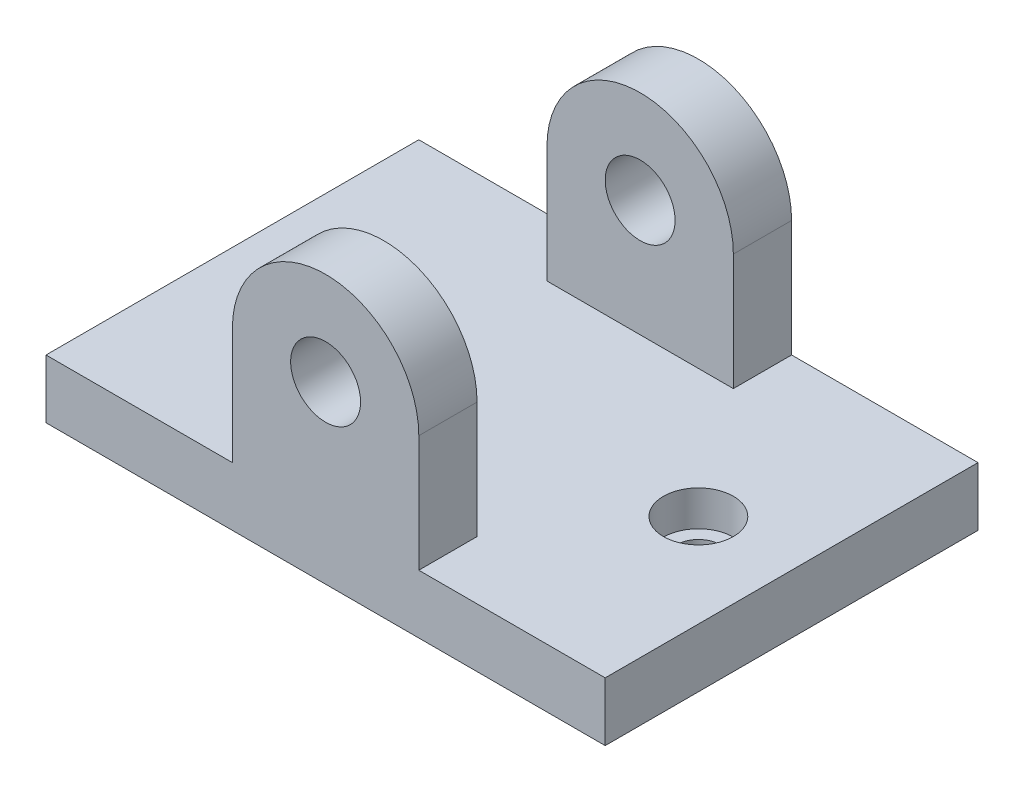
ISO-10303-21;
HEADER;
FILE_DESCRIPTION(('STEP AP214'),'2;1');
FILE_NAME('part.step','',(''),(''),'','','');
FILE_SCHEMA(('AUTOMOTIVE_DESIGN { 1 0 10303 214 1 1 1 1 }'));
ENDSEC;
DATA;
#1=APPLICATION_CONTEXT('core data for automotive mechanical design processes');
#2=APPLICATION_PROTOCOL_DEFINITION('international standard','automotive_design',2000,#1);
#3=PRODUCT_CONTEXT('',#1,'mechanical');
#4=PRODUCT('Part','Part','',(#3));
#5=PRODUCT_RELATED_PRODUCT_CATEGORY('part','',(#4));
#6=PRODUCT_DEFINITION_FORMATION('','',#4);
#7=PRODUCT_DEFINITION_CONTEXT('part definition',#1,'design');
#8=PRODUCT_DEFINITION('design','',#6,#7);
#9=PRODUCT_DEFINITION_SHAPE('','',#8);
#10=(LENGTH_UNIT() NAMED_UNIT(*) SI_UNIT(.MILLI.,.METRE.));
#11=(NAMED_UNIT(*) PLANE_ANGLE_UNIT() SI_UNIT($,.RADIAN.));
#12=(NAMED_UNIT(*) SI_UNIT($,.STERADIAN.) SOLID_ANGLE_UNIT());
#13=UNCERTAINTY_MEASURE_WITH_UNIT(LENGTH_MEASURE(1.E-05),#10,'distance_accuracy_value','');
#14=(GEOMETRIC_REPRESENTATION_CONTEXT(3) GLOBAL_UNCERTAINTY_ASSIGNED_CONTEXT((#13)) GLOBAL_UNIT_ASSIGNED_CONTEXT((#10,
#11,#12)) REPRESENTATION_CONTEXT('',''));
#15=CARTESIAN_POINT('',(0.,0.,0.));
#16=DIRECTION('',(0.,0.,1.));
#17=DIRECTION('',(1.,0.,0.));
#18=AXIS2_PLACEMENT_3D('',#15,#16,#17);
#19=CARTESIAN_POINT('',(0.,16.002,0.));
#20=DIRECTION('',(0.,1.,0.));
#21=DIRECTION('',(0.,0.,1.));
#22=AXIS2_PLACEMENT_3D('',#19,#20,#21);
#23=PLANE('',#22);
#24=CARTESIAN_POINT('',(-50.8,16.002,0.));
#25=DIRECTION('',(0.,1.,0.));
#26=DIRECTION('',(0.,0.,1.));
#27=AXIS2_PLACEMENT_3D('',#24,#25,#26);
#28=CIRCLE('',#27,9.525);
#29=CARTESIAN_POINT('',(-50.8,16.002,9.525));
#30=VERTEX_POINT('',#29);
#31=EDGE_CURVE('E185',#30,#30,#28,.T.);
#32=ORIENTED_EDGE('',*,*,#31,.F.);
#33=EDGE_LOOP('',(#32));
#34=FACE_BOUND('',#33,.T.);
#35=CARTESIAN_POINT('',(50.8,16.002,0.));
#36=DIRECTION('',(0.,1.,0.));
#37=DIRECTION('',(0.,0.,1.));
#38=AXIS2_PLACEMENT_3D('',#35,#36,#37);
#39=CIRCLE('',#38,9.525);
#40=CARTESIAN_POINT('',(50.8,16.002,9.525));
#41=VERTEX_POINT('',#40);
#42=EDGE_CURVE('E203',#41,#41,#39,.T.);
#43=ORIENTED_EDGE('',*,*,#42,.F.);
#44=EDGE_LOOP('',(#43));
#45=FACE_BOUND('',#44,.T.);
#46=DIRECTION('',(-1.,0.,0.));
#47=VECTOR('',#46,1.);
#48=CARTESIAN_POINT('',(-76.2,16.002,-50.8));
#49=LINE('',#48,#47);
#50=CARTESIAN_POINT('',(76.2,16.002,-50.8));
#51=VERTEX_POINT('',#50);
#52=CARTESIAN_POINT('',(25.4,16.002,-50.8));
#53=VERTEX_POINT('',#52);
#54=EDGE_CURVE('E221',#51,#53,#49,.T.);
#55=ORIENTED_EDGE('',*,*,#54,.T.);
#56=DIRECTION('',(0.,0.,-1.));
#57=VECTOR('',#56,1.);
#58=CARTESIAN_POINT('',(25.4,16.002,-34.925));
#59=LINE('',#58,#57);
#60=CARTESIAN_POINT('',(25.4,16.002,-34.925));
#61=VERTEX_POINT('',#60);
#62=EDGE_CURVE('E51',#61,#53,#59,.T.);
#63=ORIENTED_EDGE('',*,*,#62,.F.);
#64=DIRECTION('',(1.,0.,0.));
#65=VECTOR('',#64,1.);
#66=CARTESIAN_POINT('',(25.4,16.002,-34.925));
#67=LINE('',#66,#65);
#68=CARTESIAN_POINT('',(-25.4,16.002,-34.925));
#69=VERTEX_POINT('',#68);
#70=EDGE_CURVE('E56',#69,#61,#67,.T.);
#71=ORIENTED_EDGE('',*,*,#70,.F.);
#72=DIRECTION('',(0.,0.,-1.));
#73=VECTOR('',#72,1.);
#74=CARTESIAN_POINT('',(-25.4,16.002,-34.925));
#75=LINE('',#74,#73);
#76=CARTESIAN_POINT('',(-25.4,16.002,-50.8));
#77=VERTEX_POINT('',#76);
#78=EDGE_CURVE('E144',#69,#77,#75,.T.);
#79=ORIENTED_EDGE('',*,*,#78,.T.);
#80=CARTESIAN_POINT('',(-76.2,16.002,-50.8));
#81=VERTEX_POINT('',#80);
#82=EDGE_CURVE('E219',#77,#81,#49,.T.);
#83=ORIENTED_EDGE('',*,*,#82,.T.);
#84=DIRECTION('',(0.,0.,1.));
#85=VECTOR('',#84,1.);
#86=CARTESIAN_POINT('',(-76.2,16.002,-50.8));
#87=LINE('',#86,#85);
#88=CARTESIAN_POINT('',(-76.2,16.002,50.8));
#89=VERTEX_POINT('',#88);
#90=EDGE_CURVE('E223',#81,#89,#87,.T.);
#91=ORIENTED_EDGE('',*,*,#90,.T.);
#92=DIRECTION('',(1.,0.,0.));
#93=VECTOR('',#92,1.);
#94=CARTESIAN_POINT('',(-76.2,16.002,50.8));
#95=LINE('',#94,#93);
#96=CARTESIAN_POINT('',(-25.4,16.002,50.8));
#97=VERTEX_POINT('',#96);
#98=EDGE_CURVE('E226',#89,#97,#95,.T.);
#99=ORIENTED_EDGE('',*,*,#98,.T.);
#100=DIRECTION('',(0.,0.,1.));
#101=VECTOR('',#100,1.);
#102=CARTESIAN_POINT('',(-25.4,16.002,34.925));
#103=LINE('',#102,#101);
#104=CARTESIAN_POINT('',(-25.4,16.002,34.925));
#105=VERTEX_POINT('',#104);
#106=EDGE_CURVE('E183',#105,#97,#103,.T.);
#107=ORIENTED_EDGE('',*,*,#106,.F.);
#108=DIRECTION('',(1.,0.,0.));
#109=VECTOR('',#108,1.);
#110=CARTESIAN_POINT('',(25.4,16.002,34.925));
#111=LINE('',#110,#109);
#112=CARTESIAN_POINT('',(25.4,16.002,34.925));
#113=VERTEX_POINT('',#112);
#114=EDGE_CURVE('E162',#105,#113,#111,.T.);
#115=ORIENTED_EDGE('',*,*,#114,.T.);
#116=DIRECTION('',(0.,0.,1.));
#117=VECTOR('',#116,1.);
#118=CARTESIAN_POINT('',(25.4,16.002,34.925));
#119=LINE('',#118,#117);
#120=CARTESIAN_POINT('',(25.4,16.002,50.8));
#121=VERTEX_POINT('',#120);
#122=EDGE_CURVE('E175',#113,#121,#119,.T.);
#123=ORIENTED_EDGE('',*,*,#122,.T.);
#124=CARTESIAN_POINT('',(76.2,16.002,50.8));
#125=VERTEX_POINT('',#124);
#126=EDGE_CURVE('E225',#121,#125,#95,.T.);
#127=ORIENTED_EDGE('',*,*,#126,.T.);
#128=DIRECTION('',(0.,0.,-1.));
#129=VECTOR('',#128,1.);
#130=CARTESIAN_POINT('',(76.2,16.002,-50.8));
#131=LINE('',#130,#129);
#132=EDGE_CURVE('E216',#125,#51,#131,.T.);
#133=ORIENTED_EDGE('',*,*,#132,.T.);
#134=EDGE_LOOP('',(#55,#63,#71,#79,#83,#91,#99,#107,#115,#123,#127,#133));
#135=FACE_BOUND('',#134,.T.);
#136=ADVANCED_FACE('F35',(#34,#45,#135),#23,.T.);
#137=CARTESIAN_POINT('',(76.2,16.002,-50.8));
#138=DIRECTION('',(-1.,0.,0.));
#139=DIRECTION('',(0.,0.,1.));
#140=AXIS2_PLACEMENT_3D('',#137,#138,#139);
#141=PLANE('',#140);
#142=DIRECTION('',(0.,0.,-1.));
#143=VECTOR('',#142,1.);
#144=CARTESIAN_POINT('',(76.2,0.,-50.8));
#145=LINE('',#144,#143);
#146=CARTESIAN_POINT('',(76.2,0.,50.8));
#147=VERTEX_POINT('',#146);
#148=CARTESIAN_POINT('',(76.2,0.,-50.8));
#149=VERTEX_POINT('',#148);
#150=EDGE_CURVE('E215',#147,#149,#145,.T.);
#151=ORIENTED_EDGE('',*,*,#150,.T.);
#152=DIRECTION('',(0.,-1.,0.));
#153=VECTOR('',#152,1.);
#154=CARTESIAN_POINT('',(76.2,16.002,-50.8));
#155=LINE('',#154,#153);
#156=EDGE_CURVE('E11',#51,#149,#155,.T.);
#157=ORIENTED_EDGE('',*,*,#156,.F.);
#158=ORIENTED_EDGE('',*,*,#132,.F.);
#159=DIRECTION('',(0.,-1.,0.));
#160=VECTOR('',#159,1.);
#161=CARTESIAN_POINT('',(76.2,16.002,50.8));
#162=LINE('',#161,#160);
#163=EDGE_CURVE('E229',#125,#147,#162,.T.);
#164=ORIENTED_EDGE('',*,*,#163,.T.);
#165=EDGE_LOOP('',(#151,#157,#158,#164));
#166=FACE_BOUND('',#165,.T.);
#167=ADVANCED_FACE('F37',(#166),#141,.F.);
#168=CARTESIAN_POINT('',(-76.2,16.002,-50.8));
#169=DIRECTION('',(0.,0.,1.));
#170=DIRECTION('',(1.,0.,0.));
#171=AXIS2_PLACEMENT_3D('',#168,#169,#170);
#172=PLANE('',#171);
#173=CARTESIAN_POINT('',(0.,47.752,-50.8));
#174=DIRECTION('',(0.,0.,1.));
#175=DIRECTION('',(1.,0.,0.));
#176=AXIS2_PLACEMENT_3D('',#173,#174,#175);
#177=CIRCLE('',#176,9.525);
#178=CARTESIAN_POINT('',(9.52500000000001,47.752,-50.8));
#179=VERTEX_POINT('',#178);
#180=EDGE_CURVE('E314',#179,#179,#177,.T.);
#181=ORIENTED_EDGE('',*,*,#180,.T.);
#182=EDGE_LOOP('',(#181));
#183=FACE_BOUND('',#182,.T.);
#184=DIRECTION('',(-1.,0.,0.));
#185=VECTOR('',#184,1.);
#186=CARTESIAN_POINT('',(-76.2,0.,-50.8));
#187=LINE('',#186,#185);
#188=CARTESIAN_POINT('',(-76.2,0.,-50.8));
#189=VERTEX_POINT('',#188);
#190=EDGE_CURVE('E232',#149,#189,#187,.T.);
#191=ORIENTED_EDGE('',*,*,#190,.T.);
#192=DIRECTION('',(0.,-1.,0.));
#193=VECTOR('',#192,1.);
#194=CARTESIAN_POINT('',(-76.2,16.002,-50.8));
#195=LINE('',#194,#193);
#196=EDGE_CURVE('E44',#81,#189,#195,.T.);
#197=ORIENTED_EDGE('',*,*,#196,.F.);
#198=ORIENTED_EDGE('',*,*,#82,.F.);
#199=DIRECTION('',(0.,-1.,0.));
#200=VECTOR('',#199,1.);
#201=CARTESIAN_POINT('',(-25.4,16.002,-50.8));
#202=LINE('',#201,#200);
#203=CARTESIAN_POINT('',(-25.4,47.752,-50.8));
#204=VERTEX_POINT('',#203);
#205=EDGE_CURVE('E153',#204,#77,#202,.T.);
#206=ORIENTED_EDGE('',*,*,#205,.F.);
#207=CARTESIAN_POINT('',(0.,47.752,-50.8));
#208=DIRECTION('',(0.,0.,1.));
#209=DIRECTION('',(-1.,0.,0.));
#210=AXIS2_PLACEMENT_3D('',#207,#208,#209);
#211=CIRCLE('',#210,25.4);
#212=CARTESIAN_POINT('',(25.4,47.752,-50.8));
#213=VERTEX_POINT('',#212);
#214=EDGE_CURVE('E139',#213,#204,#211,.T.);
#215=ORIENTED_EDGE('',*,*,#214,.F.);
#216=DIRECTION('',(0.,1.,0.));
#217=VECTOR('',#216,1.);
#218=CARTESIAN_POINT('',(25.4,47.752,-50.8));
#219=LINE('',#218,#217);
#220=EDGE_CURVE('E148',#53,#213,#219,.T.);
#221=ORIENTED_EDGE('',*,*,#220,.F.);
#222=ORIENTED_EDGE('',*,*,#54,.F.);
#223=ORIENTED_EDGE('',*,*,#156,.T.);
#224=EDGE_LOOP('',(#191,#197,#198,#206,#215,#221,#222,#223));
#225=FACE_BOUND('',#224,.T.);
#226=ADVANCED_FACE('F275',(#183,#225),#172,.F.);
#227=CARTESIAN_POINT('',(-76.2,16.002,-50.8));
#228=DIRECTION('',(1.,0.,0.));
#229=DIRECTION('',(0.,0.,-1.));
#230=AXIS2_PLACEMENT_3D('',#227,#228,#229);
#231=PLANE('',#230);
#232=DIRECTION('',(0.,0.,1.));
#233=VECTOR('',#232,1.);
#234=CARTESIAN_POINT('',(-76.2,0.,-50.8));
#235=LINE('',#234,#233);
#236=CARTESIAN_POINT('',(-76.2,0.,50.8));
#237=VERTEX_POINT('',#236);
#238=EDGE_CURVE('E234',#189,#237,#235,.T.);
#239=ORIENTED_EDGE('',*,*,#238,.T.);
#240=DIRECTION('',(0.,-1.,0.));
#241=VECTOR('',#240,1.);
#242=CARTESIAN_POINT('',(-76.2,16.002,50.8));
#243=LINE('',#242,#241);
#244=EDGE_CURVE('E239',#89,#237,#243,.T.);
#245=ORIENTED_EDGE('',*,*,#244,.F.);
#246=ORIENTED_EDGE('',*,*,#90,.F.);
#247=ORIENTED_EDGE('',*,*,#196,.T.);
#248=EDGE_LOOP('',(#239,#245,#246,#247));
#249=FACE_BOUND('',#248,.T.);
#250=ADVANCED_FACE('F247',(#249),#231,.F.);
#251=CARTESIAN_POINT('',(-76.2,16.002,50.8));
#252=DIRECTION('',(0.,0.,-1.));
#253=DIRECTION('',(-1.,0.,0.));
#254=AXIS2_PLACEMENT_3D('',#251,#252,#253);
#255=PLANE('',#254);
#256=CARTESIAN_POINT('',(0.,47.752,50.8));
#257=DIRECTION('',(0.,0.,1.));
#258=DIRECTION('',(1.,0.,0.));
#259=AXIS2_PLACEMENT_3D('',#256,#257,#258);
#260=CIRCLE('',#259,9.525);
#261=CARTESIAN_POINT('',(9.52500000000001,47.752,50.8));
#262=VERTEX_POINT('',#261);
#263=EDGE_CURVE('E316',#262,#262,#260,.T.);
#264=ORIENTED_EDGE('',*,*,#263,.F.);
#265=EDGE_LOOP('',(#264));
#266=FACE_BOUND('',#265,.T.);
#267=DIRECTION('',(1.,0.,0.));
#268=VECTOR('',#267,1.);
#269=CARTESIAN_POINT('',(-76.2,0.,50.8));
#270=LINE('',#269,#268);
#271=EDGE_CURVE('E220',#237,#147,#270,.T.);
#272=ORIENTED_EDGE('',*,*,#271,.T.);
#273=ORIENTED_EDGE('',*,*,#163,.F.);
#274=ORIENTED_EDGE('',*,*,#126,.F.);
#275=DIRECTION('',(0.,1.,0.));
#276=VECTOR('',#275,1.);
#277=CARTESIAN_POINT('',(25.4,47.752,50.8));
#278=LINE('',#277,#276);
#279=CARTESIAN_POINT('',(25.4,47.752,50.8));
#280=VERTEX_POINT('',#279);
#281=EDGE_CURVE('E159',#121,#280,#278,.T.);
#282=ORIENTED_EDGE('',*,*,#281,.T.);
#283=CARTESIAN_POINT('',(0.,47.752,50.8));
#284=DIRECTION('',(0.,0.,1.));
#285=DIRECTION('',(-1.,0.,0.));
#286=AXIS2_PLACEMENT_3D('',#283,#284,#285);
#287=CIRCLE('',#286,25.4);
#288=CARTESIAN_POINT('',(-25.4,47.752,50.8));
#289=VERTEX_POINT('',#288);
#290=EDGE_CURVE('E178',#280,#289,#287,.T.);
#291=ORIENTED_EDGE('',*,*,#290,.T.);
#292=DIRECTION('',(0.,-1.,0.));
#293=VECTOR('',#292,1.);
#294=CARTESIAN_POINT('',(-25.4,16.002,50.8));
#295=LINE('',#294,#293);
#296=EDGE_CURVE('E166',#289,#97,#295,.T.);
#297=ORIENTED_EDGE('',*,*,#296,.T.);
#298=ORIENTED_EDGE('',*,*,#98,.F.);
#299=ORIENTED_EDGE('',*,*,#244,.T.);
#300=EDGE_LOOP('',(#272,#273,#274,#282,#291,#297,#298,#299));
#301=FACE_BOUND('',#300,.T.);
#302=ADVANCED_FACE('F256',(#266,#301),#255,.F.);
#303=CARTESIAN_POINT('',(0.,0.,0.));
#304=DIRECTION('',(0.,1.,0.));
#305=DIRECTION('',(0.,0.,1.));
#306=AXIS2_PLACEMENT_3D('',#303,#304,#305);
#307=PLANE('',#306);
#308=CARTESIAN_POINT('',(-50.8,0.,0.));
#309=DIRECTION('',(0.,1.,0.));
#310=DIRECTION('',(0.,0.,1.));
#311=AXIS2_PLACEMENT_3D('',#308,#309,#310);
#312=CIRCLE('',#311,5.9563);
#313=CARTESIAN_POINT('',(-50.8,0.,5.9563));
#314=VERTEX_POINT('',#313);
#315=EDGE_CURVE('E200',#314,#314,#312,.T.);
#316=ORIENTED_EDGE('',*,*,#315,.T.);
#317=EDGE_LOOP('',(#316));
#318=FACE_BOUND('',#317,.T.);
#319=CARTESIAN_POINT('',(50.8,0.,0.));
#320=DIRECTION('',(0.,1.,0.));
#321=DIRECTION('',(0.,0.,1.));
#322=AXIS2_PLACEMENT_3D('',#319,#320,#321);
#323=CIRCLE('',#322,5.9563);
#324=CARTESIAN_POINT('',(50.8,0.,5.9563));
#325=VERTEX_POINT('',#324);
#326=EDGE_CURVE('E212',#325,#325,#323,.T.);
#327=ORIENTED_EDGE('',*,*,#326,.T.);
#328=EDGE_LOOP('',(#327));
#329=FACE_BOUND('',#328,.T.);
#330=ORIENTED_EDGE('',*,*,#150,.F.);
#331=ORIENTED_EDGE('',*,*,#271,.F.);
#332=ORIENTED_EDGE('',*,*,#238,.F.);
#333=ORIENTED_EDGE('',*,*,#190,.F.);
#334=EDGE_LOOP('',(#330,#331,#332,#333));
#335=FACE_BOUND('',#334,.T.);
#336=ADVANCED_FACE('F253',(#318,#329,#335),#307,.F.);
#337=CARTESIAN_POINT('',(50.8,16.002,0.));
#338=DIRECTION('',(0.,1.,0.));
#339=DIRECTION('',(0.,0.,1.));
#340=AXIS2_PLACEMENT_3D('',#337,#338,#339);
#341=CYLINDRICAL_SURFACE('',#340,5.9563);
#342=ORIENTED_EDGE('',*,*,#326,.F.);
#343=EDGE_LOOP('',(#342));
#344=FACE_BOUND('',#343,.T.);
#345=CARTESIAN_POINT('',(50.8,6.35,0.));
#346=DIRECTION('',(0.,1.,0.));
#347=DIRECTION('',(0.,0.,1.));
#348=AXIS2_PLACEMENT_3D('',#345,#346,#347);
#349=CIRCLE('',#348,5.9563);
#350=CARTESIAN_POINT('',(50.8,6.35,5.9563));
#351=VERTEX_POINT('',#350);
#352=EDGE_CURVE('E209',#351,#351,#349,.T.);
#353=ORIENTED_EDGE('',*,*,#352,.T.);
#354=EDGE_LOOP('',(#353));
#355=FACE_BOUND('',#354,.T.);
#356=ADVANCED_FACE('F299',(#344,#355),#341,.F.);
#357=CARTESIAN_POINT('',(56.7563,6.35,0.));
#358=DIRECTION('',(0.,-1.,0.));
#359=DIRECTION('',(0.,0.,-1.));
#360=AXIS2_PLACEMENT_3D('',#357,#358,#359);
#361=PLANE('',#360);
#362=ORIENTED_EDGE('',*,*,#352,.F.);
#363=EDGE_LOOP('',(#362));
#364=FACE_BOUND('',#363,.T.);
#365=CARTESIAN_POINT('',(50.8,6.35,0.));
#366=DIRECTION('',(0.,1.,0.));
#367=DIRECTION('',(0.,0.,1.));
#368=AXIS2_PLACEMENT_3D('',#365,#366,#367);
#369=CIRCLE('',#368,9.525);
#370=CARTESIAN_POINT('',(50.8,6.35,9.525));
#371=VERTEX_POINT('',#370);
#372=EDGE_CURVE('E206',#371,#371,#369,.T.);
#373=ORIENTED_EDGE('',*,*,#372,.T.);
#374=EDGE_LOOP('',(#373));
#375=FACE_BOUND('',#374,.T.);
#376=ADVANCED_FACE('F365',(#364,#375),#361,.F.);
#377=CARTESIAN_POINT('',(50.8,16.002,0.));
#378=DIRECTION('',(0.,1.,0.));
#379=DIRECTION('',(0.,0.,1.));
#380=AXIS2_PLACEMENT_3D('',#377,#378,#379);
#381=CYLINDRICAL_SURFACE('',#380,9.525);
#382=ORIENTED_EDGE('',*,*,#372,.F.);
#383=EDGE_LOOP('',(#382));
#384=FACE_BOUND('',#383,.T.);
#385=ORIENTED_EDGE('',*,*,#42,.T.);
#386=EDGE_LOOP('',(#385));
#387=FACE_BOUND('',#386,.T.);
#388=ADVANCED_FACE('F362',(#384,#387),#381,.F.);
#389=CARTESIAN_POINT('',(-50.8,16.002,0.));
#390=DIRECTION('',(0.,1.,0.));
#391=DIRECTION('',(0.,0.,1.));
#392=AXIS2_PLACEMENT_3D('',#389,#390,#391);
#393=CYLINDRICAL_SURFACE('',#392,5.9563);
#394=ORIENTED_EDGE('',*,*,#315,.F.);
#395=EDGE_LOOP('',(#394));
#396=FACE_BOUND('',#395,.T.);
#397=CARTESIAN_POINT('',(-50.8,6.35,0.));
#398=DIRECTION('',(0.,1.,0.));
#399=DIRECTION('',(0.,0.,1.));
#400=AXIS2_PLACEMENT_3D('',#397,#398,#399);
#401=CIRCLE('',#400,5.9563);
#402=CARTESIAN_POINT('',(-50.8,6.35,5.9563));
#403=VERTEX_POINT('',#402);
#404=EDGE_CURVE('E197',#403,#403,#401,.T.);
#405=ORIENTED_EDGE('',*,*,#404,.T.);
#406=EDGE_LOOP('',(#405));
#407=FACE_BOUND('',#406,.T.);
#408=ADVANCED_FACE('F358',(#396,#407),#393,.F.);
#409=CARTESIAN_POINT('',(-44.8437,6.35,0.));
#410=DIRECTION('',(0.,-1.,0.));
#411=DIRECTION('',(0.,0.,-1.));
#412=AXIS2_PLACEMENT_3D('',#409,#410,#411);
#413=PLANE('',#412);
#414=ORIENTED_EDGE('',*,*,#404,.F.);
#415=EDGE_LOOP('',(#414));
#416=FACE_BOUND('',#415,.T.);
#417=CARTESIAN_POINT('',(-50.8,6.35,0.));
#418=DIRECTION('',(0.,1.,0.));
#419=DIRECTION('',(0.,0.,1.));
#420=AXIS2_PLACEMENT_3D('',#417,#418,#419);
#421=CIRCLE('',#420,9.525);
#422=CARTESIAN_POINT('',(-50.8,6.35,9.525));
#423=VERTEX_POINT('',#422);
#424=EDGE_CURVE('E194',#423,#423,#421,.T.);
#425=ORIENTED_EDGE('',*,*,#424,.T.);
#426=EDGE_LOOP('',(#425));
#427=FACE_BOUND('',#426,.T.);
#428=ADVANCED_FACE('F354',(#416,#427),#413,.F.);
#429=CARTESIAN_POINT('',(-50.8,16.002,0.));
#430=DIRECTION('',(0.,1.,0.));
#431=DIRECTION('',(0.,0.,1.));
#432=AXIS2_PLACEMENT_3D('',#429,#430,#431);
#433=CYLINDRICAL_SURFACE('',#432,9.525);
#434=ORIENTED_EDGE('',*,*,#424,.F.);
#435=EDGE_LOOP('',(#434));
#436=FACE_BOUND('',#435,.T.);
#437=ORIENTED_EDGE('',*,*,#31,.T.);
#438=EDGE_LOOP('',(#437));
#439=FACE_BOUND('',#438,.T.);
#440=ADVANCED_FACE('F347',(#436,#439),#433,.F.);
#441=CARTESIAN_POINT('',(-25.4,16.002,34.925));
#442=DIRECTION('',(-1.,0.,0.));
#443=DIRECTION('',(0.,0.,1.));
#444=AXIS2_PLACEMENT_3D('',#441,#442,#443);
#445=PLANE('',#444);
#446=ORIENTED_EDGE('',*,*,#296,.F.);
#447=DIRECTION('',(0.,0.,1.));
#448=VECTOR('',#447,1.);
#449=CARTESIAN_POINT('',(-25.4,47.752,34.925));
#450=LINE('',#449,#448);
#451=CARTESIAN_POINT('',(-25.4,47.752,34.925));
#452=VERTEX_POINT('',#451);
#453=EDGE_CURVE('E186',#452,#289,#450,.T.);
#454=ORIENTED_EDGE('',*,*,#453,.F.);
#455=DIRECTION('',(0.,-1.,0.));
#456=VECTOR('',#455,1.);
#457=CARTESIAN_POINT('',(-25.4,16.002,34.925));
#458=LINE('',#457,#456);
#459=EDGE_CURVE('E172',#452,#105,#458,.T.);
#460=ORIENTED_EDGE('',*,*,#459,.T.);
#461=ORIENTED_EDGE('',*,*,#106,.T.);
#462=EDGE_LOOP('',(#446,#454,#460,#461));
#463=FACE_BOUND('',#462,.T.);
#464=ADVANCED_FACE('F273',(#463),#445,.T.);
#465=CARTESIAN_POINT('',(0.,47.752,34.925));
#466=DIRECTION('',(0.,0.,1.));
#467=DIRECTION('',(1.,0.,0.));
#468=AXIS2_PLACEMENT_3D('',#465,#466,#467);
#469=CYLINDRICAL_SURFACE('',#468,25.4);
#470=ORIENTED_EDGE('',*,*,#290,.F.);
#471=DIRECTION('',(0.,0.,1.));
#472=VECTOR('',#471,1.);
#473=CARTESIAN_POINT('',(25.4,47.752,34.925));
#474=LINE('',#473,#472);
#475=CARTESIAN_POINT('',(25.4,47.752,34.925));
#476=VERTEX_POINT('',#475);
#477=EDGE_CURVE('E188',#476,#280,#474,.T.);
#478=ORIENTED_EDGE('',*,*,#477,.F.);
#479=CARTESIAN_POINT('',(0.,47.752,34.925));
#480=DIRECTION('',(0.,0.,1.));
#481=DIRECTION('',(-1.,0.,0.));
#482=AXIS2_PLACEMENT_3D('',#479,#480,#481);
#483=CIRCLE('',#482,25.4);
#484=EDGE_CURVE('E169',#476,#452,#483,.T.);
#485=ORIENTED_EDGE('',*,*,#484,.T.);
#486=ORIENTED_EDGE('',*,*,#453,.T.);
#487=EDGE_LOOP('',(#470,#478,#485,#486));
#488=FACE_BOUND('',#487,.T.);
#489=ADVANCED_FACE('F270',(#488),#469,.T.);
#490=CARTESIAN_POINT('',(25.4,47.752,34.925));
#491=DIRECTION('',(1.,0.,0.));
#492=DIRECTION('',(0.,1.,0.));
#493=AXIS2_PLACEMENT_3D('',#490,#491,#492);
#494=PLANE('',#493);
#495=ORIENTED_EDGE('',*,*,#281,.F.);
#496=ORIENTED_EDGE('',*,*,#122,.F.);
#497=DIRECTION('',(0.,1.,0.));
#498=VECTOR('',#497,1.);
#499=CARTESIAN_POINT('',(25.4,47.752,34.925));
#500=LINE('',#499,#498);
#501=EDGE_CURVE('E165',#113,#476,#500,.T.);
#502=ORIENTED_EDGE('',*,*,#501,.T.);
#503=ORIENTED_EDGE('',*,*,#477,.T.);
#504=EDGE_LOOP('',(#495,#496,#502,#503));
#505=FACE_BOUND('',#504,.T.);
#506=ADVANCED_FACE('F266',(#505),#494,.T.);
#507=CARTESIAN_POINT('',(0.,47.752,34.925));
#508=DIRECTION('',(0.,0.,-1.));
#509=DIRECTION('',(-1.,0.,0.));
#510=AXIS2_PLACEMENT_3D('',#507,#508,#509);
#511=PLANE('',#510);
#512=CARTESIAN_POINT('',(0.,47.752,34.925));
#513=DIRECTION('',(0.,0.,-1.));
#514=DIRECTION('',(-1.,0.,0.));
#515=AXIS2_PLACEMENT_3D('',#512,#513,#514);
#516=CIRCLE('',#515,9.525);
#517=CARTESIAN_POINT('',(-9.52499999999999,47.752,34.925));
#518=VERTEX_POINT('',#517);
#519=EDGE_CURVE('E155',#518,#518,#516,.T.);
#520=ORIENTED_EDGE('',*,*,#519,.F.);
#521=EDGE_LOOP('',(#520));
#522=FACE_BOUND('',#521,.T.);
#523=ORIENTED_EDGE('',*,*,#114,.F.);
#524=ORIENTED_EDGE('',*,*,#459,.F.);
#525=ORIENTED_EDGE('',*,*,#484,.F.);
#526=ORIENTED_EDGE('',*,*,#501,.F.);
#527=EDGE_LOOP('',(#523,#524,#525,#526));
#528=FACE_BOUND('',#527,.T.);
#529=ADVANCED_FACE('F279',(#522,#528),#511,.T.);
#530=CARTESIAN_POINT('',(25.4,47.752,-34.925));
#531=DIRECTION('',(-1.,0.,0.));
#532=DIRECTION('',(0.,-1.,0.));
#533=AXIS2_PLACEMENT_3D('',#530,#531,#532);
#534=PLANE('',#533);
#535=ORIENTED_EDGE('',*,*,#220,.T.);
#536=DIRECTION('',(0.,0.,-1.));
#537=VECTOR('',#536,1.);
#538=CARTESIAN_POINT('',(25.4,47.752,-34.925));
#539=LINE('',#538,#537);
#540=CARTESIAN_POINT('',(25.4,47.752,-34.925));
#541=VERTEX_POINT('',#540);
#542=EDGE_CURVE('E143',#541,#213,#539,.T.);
#543=ORIENTED_EDGE('',*,*,#542,.F.);
#544=DIRECTION('',(0.,1.,0.));
#545=VECTOR('',#544,1.);
#546=CARTESIAN_POINT('',(25.4,47.752,-34.925));
#547=LINE('',#546,#545);
#548=EDGE_CURVE('E130',#61,#541,#547,.T.);
#549=ORIENTED_EDGE('',*,*,#548,.F.);
#550=ORIENTED_EDGE('',*,*,#62,.T.);
#551=EDGE_LOOP('',(#535,#543,#549,#550));
#552=FACE_BOUND('',#551,.T.);
#553=ADVANCED_FACE('F277',(#552),#534,.F.);
#554=CARTESIAN_POINT('',(0.,47.752,-34.925));
#555=DIRECTION('',(0.,0.,-1.));
#556=DIRECTION('',(-1.,0.,0.));
#557=AXIS2_PLACEMENT_3D('',#554,#555,#556);
#558=CYLINDRICAL_SURFACE('',#557,25.4);
#559=ORIENTED_EDGE('',*,*,#214,.T.);
#560=DIRECTION('',(0.,0.,-1.));
#561=VECTOR('',#560,1.);
#562=CARTESIAN_POINT('',(-25.4,47.752,-34.925));
#563=LINE('',#562,#561);
#564=CARTESIAN_POINT('',(-25.4,47.752,-34.925));
#565=VERTEX_POINT('',#564);
#566=EDGE_CURVE('E136',#565,#204,#563,.T.);
#567=ORIENTED_EDGE('',*,*,#566,.F.);
#568=CARTESIAN_POINT('',(0.,47.752,-34.925));
#569=DIRECTION('',(0.,0.,1.));
#570=DIRECTION('',(-1.,0.,0.));
#571=AXIS2_PLACEMENT_3D('',#568,#569,#570);
#572=CIRCLE('',#571,25.4);
#573=EDGE_CURVE('E124',#541,#565,#572,.T.);
#574=ORIENTED_EDGE('',*,*,#573,.F.);
#575=ORIENTED_EDGE('',*,*,#542,.T.);
#576=EDGE_LOOP('',(#559,#567,#574,#575));
#577=FACE_BOUND('',#576,.T.);
#578=ADVANCED_FACE('F137',(#577),#558,.T.);
#579=CARTESIAN_POINT('',(-25.4,16.002,-34.925));
#580=DIRECTION('',(1.,0.,0.));
#581=DIRECTION('',(0.,0.,-1.));
#582=AXIS2_PLACEMENT_3D('',#579,#580,#581);
#583=PLANE('',#582);
#584=ORIENTED_EDGE('',*,*,#205,.T.);
#585=ORIENTED_EDGE('',*,*,#78,.F.);
#586=DIRECTION('',(0.,-1.,0.));
#587=VECTOR('',#586,1.);
#588=CARTESIAN_POINT('',(-25.4,16.002,-34.925));
#589=LINE('',#588,#587);
#590=EDGE_CURVE('E128',#565,#69,#589,.T.);
#591=ORIENTED_EDGE('',*,*,#590,.F.);
#592=ORIENTED_EDGE('',*,*,#566,.T.);
#593=EDGE_LOOP('',(#584,#585,#591,#592));
#594=FACE_BOUND('',#593,.T.);
#595=ADVANCED_FACE('F146',(#594),#583,.F.);
#596=CARTESIAN_POINT('',(0.,47.752,-34.925));
#597=DIRECTION('',(0.,0.,1.));
#598=DIRECTION('',(-1.,0.,0.));
#599=AXIS2_PLACEMENT_3D('',#596,#597,#598);
#600=PLANE('',#599);
#601=CARTESIAN_POINT('',(0.,47.752,-34.925));
#602=DIRECTION('',(0.,0.,1.));
#603=DIRECTION('',(1.,0.,0.));
#604=AXIS2_PLACEMENT_3D('',#601,#602,#603);
#605=CIRCLE('',#604,9.525);
#606=CARTESIAN_POINT('',(9.52500000000001,47.752,-34.925));
#607=VERTEX_POINT('',#606);
#608=EDGE_CURVE('E39',#607,#607,#605,.T.);
#609=ORIENTED_EDGE('',*,*,#608,.F.);
#610=EDGE_LOOP('',(#609));
#611=FACE_BOUND('',#610,.T.);
#612=ORIENTED_EDGE('',*,*,#70,.T.);
#613=ORIENTED_EDGE('',*,*,#548,.T.);
#614=ORIENTED_EDGE('',*,*,#573,.T.);
#615=ORIENTED_EDGE('',*,*,#590,.T.);
#616=EDGE_LOOP('',(#612,#613,#614,#615));
#617=FACE_BOUND('',#616,.T.);
#618=ADVANCED_FACE('F126',(#611,#617),#600,.T.);
#619=CARTESIAN_POINT('',(0.,47.752,-50.8));
#620=DIRECTION('',(0.,0.,1.));
#621=DIRECTION('',(1.,0.,0.));
#622=AXIS2_PLACEMENT_3D('',#619,#620,#621);
#623=CYLINDRICAL_SURFACE('',#622,9.525);
#624=ORIENTED_EDGE('',*,*,#608,.T.);
#625=EDGE_LOOP('',(#624));
#626=FACE_BOUND('',#625,.T.);
#627=ORIENTED_EDGE('',*,*,#180,.F.);
#628=EDGE_LOOP('',(#627));
#629=FACE_BOUND('',#628,.T.);
#630=ADVANCED_FACE('F328',(#626,#629),#623,.F.);
#631=ORIENTED_EDGE('',*,*,#519,.T.);
#632=EDGE_LOOP('',(#631));
#633=FACE_BOUND('',#632,.T.);
#634=ORIENTED_EDGE('',*,*,#263,.T.);
#635=EDGE_LOOP('',(#634));
#636=FACE_BOUND('',#635,.T.);
#637=ADVANCED_FACE('F324',(#633,#636),#623,.F.);
#638=CLOSED_SHELL('',(#136,#167,#226,#250,#302,#336,#356,#376,#388,#408,#428,#440,#464,#489,
#506,#529,#553,#578,#595,#618,#630,#637));
#639=MANIFOLD_SOLID_BREP('B2',#638);
#640=ADVANCED_BREP_SHAPE_REPRESENTATION('',(#18,#639),#14);
#641=SHAPE_DEFINITION_REPRESENTATION(#9,#640);
ENDSEC;
END-ISO-10303-21;
